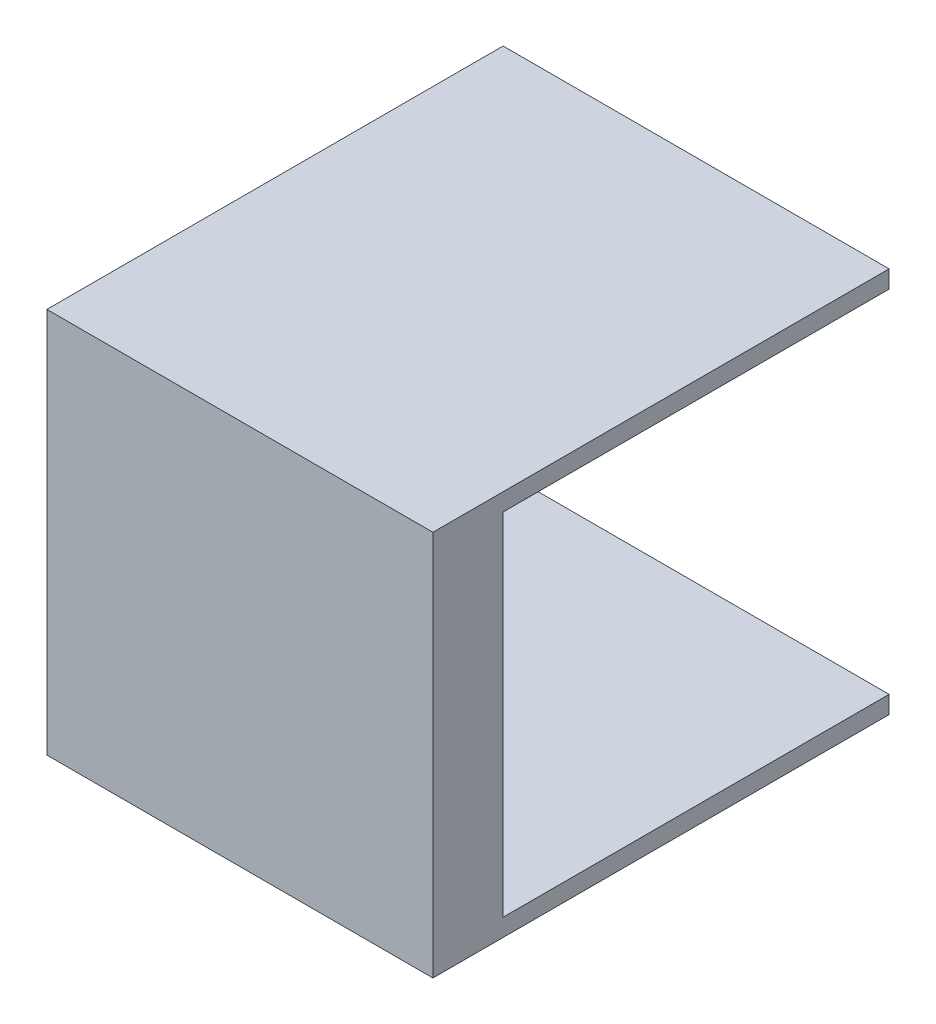
ISO-10303-21;
HEADER;
FILE_DESCRIPTION(('STEP AP214'),'2;1');
FILE_NAME('part.step','',(''),(''),'','','');
FILE_SCHEMA(('AUTOMOTIVE_DESIGN { 1 0 10303 214 1 1 1 1 }'));
ENDSEC;
DATA;
#1=APPLICATION_CONTEXT('core data for automotive mechanical design processes');
#2=APPLICATION_PROTOCOL_DEFINITION('international standard','automotive_design',2000,#1);
#3=PRODUCT_CONTEXT('',#1,'mechanical');
#4=PRODUCT('Part','Part','',(#3));
#5=PRODUCT_RELATED_PRODUCT_CATEGORY('part','',(#4));
#6=PRODUCT_DEFINITION_FORMATION('','',#4);
#7=PRODUCT_DEFINITION_CONTEXT('part definition',#1,'design');
#8=PRODUCT_DEFINITION('design','',#6,#7);
#9=PRODUCT_DEFINITION_SHAPE('','',#8);
#10=(LENGTH_UNIT() NAMED_UNIT(*) SI_UNIT(.MILLI.,.METRE.));
#11=(NAMED_UNIT(*) PLANE_ANGLE_UNIT() SI_UNIT($,.RADIAN.));
#12=(NAMED_UNIT(*) SI_UNIT($,.STERADIAN.) SOLID_ANGLE_UNIT());
#13=UNCERTAINTY_MEASURE_WITH_UNIT(LENGTH_MEASURE(1.E-05),#10,'distance_accuracy_value','');
#14=(GEOMETRIC_REPRESENTATION_CONTEXT(3) GLOBAL_UNCERTAINTY_ASSIGNED_CONTEXT((#13)) GLOBAL_UNIT_ASSIGNED_CONTEXT((#10,
#11,#12)) REPRESENTATION_CONTEXT('',''));
#15=CARTESIAN_POINT('',(0.,0.,0.));
#16=DIRECTION('',(0.,0.,1.));
#17=DIRECTION('',(1.,0.,0.));
#18=AXIS2_PLACEMENT_3D('',#15,#16,#17);
#19=CARTESIAN_POINT('',(55.,55.,130.));
#20=DIRECTION('',(-1.,0.,0.));
#21=DIRECTION('',(0.,-1.,0.));
#22=AXIS2_PLACEMENT_3D('',#19,#20,#21);
#23=PLANE('',#22);
#24=DIRECTION('',(0.,0.,1.));
#25=VECTOR('',#24,1.);
#26=CARTESIAN_POINT('',(55.,-50.,110.));
#27=LINE('',#26,#25);
#28=CARTESIAN_POINT('',(55.,-50.,0.));
#29=VERTEX_POINT('',#28);
#30=CARTESIAN_POINT('',(55.,-50.,110.));
#31=VERTEX_POINT('',#30);
#32=EDGE_CURVE('E118',#29,#31,#27,.T.);
#33=ORIENTED_EDGE('',*,*,#32,.T.);
#34=DIRECTION('',(0.,1.,0.));
#35=VECTOR('',#34,1.);
#36=CARTESIAN_POINT('',(55.,50.,110.));
#37=LINE('',#36,#35);
#38=CARTESIAN_POINT('',(55.,50.,110.));
#39=VERTEX_POINT('',#38);
#40=EDGE_CURVE('E129',#31,#39,#37,.T.);
#41=ORIENTED_EDGE('',*,*,#40,.T.);
#42=DIRECTION('',(0.,0.,-1.));
#43=VECTOR('',#42,1.);
#44=CARTESIAN_POINT('',(55.,50.,0.));
#45=LINE('',#44,#43);
#46=CARTESIAN_POINT('',(55.,50.,0.));
#47=VERTEX_POINT('',#46);
#48=EDGE_CURVE('E136',#39,#47,#45,.T.);
#49=ORIENTED_EDGE('',*,*,#48,.T.);
#50=DIRECTION('',(0.,1.,0.));
#51=VECTOR('',#50,1.);
#52=CARTESIAN_POINT('',(55.,55.,0.));
#53=LINE('',#52,#51);
#54=CARTESIAN_POINT('',(55.,55.,0.));
#55=VERTEX_POINT('',#54);
#56=EDGE_CURVE('E160',#47,#55,#53,.T.);
#57=ORIENTED_EDGE('',*,*,#56,.T.);
#58=DIRECTION('',(0.,0.,-1.));
#59=VECTOR('',#58,1.);
#60=CARTESIAN_POINT('',(55.,55.,130.));
#61=LINE('',#60,#59);
#62=CARTESIAN_POINT('',(55.,55.,130.));
#63=VERTEX_POINT('',#62);
#64=EDGE_CURVE('E11',#63,#55,#61,.T.);
#65=ORIENTED_EDGE('',*,*,#64,.F.);
#66=DIRECTION('',(0.,1.,0.));
#67=VECTOR('',#66,1.);
#68=CARTESIAN_POINT('',(55.,55.,130.));
#69=LINE('',#68,#67);
#70=CARTESIAN_POINT('',(55.,-55.,130.));
#71=VERTEX_POINT('',#70);
#72=EDGE_CURVE('E163',#71,#63,#69,.T.);
#73=ORIENTED_EDGE('',*,*,#72,.F.);
#74=DIRECTION('',(0.,0.,-1.));
#75=VECTOR('',#74,1.);
#76=CARTESIAN_POINT('',(55.,-55.,130.));
#77=LINE('',#76,#75);
#78=CARTESIAN_POINT('',(55.,-55.,0.));
#79=VERTEX_POINT('',#78);
#80=EDGE_CURVE('E173',#71,#79,#77,.T.);
#81=ORIENTED_EDGE('',*,*,#80,.T.);
#82=EDGE_CURVE('E139',#79,#29,#53,.T.);
#83=ORIENTED_EDGE('',*,*,#82,.T.);
#84=EDGE_LOOP('',(#33,#41,#49,#57,#65,#73,#81,#83));
#85=FACE_BOUND('',#84,.T.);
#86=ADVANCED_FACE('F39',(#85),#23,.F.);
#87=CARTESIAN_POINT('',(0.,0.,0.));
#88=DIRECTION('',(0.,0.,1.));
#89=DIRECTION('',(1.,0.,0.));
#90=AXIS2_PLACEMENT_3D('',#87,#88,#89);
#91=PLANE('',#90);
#92=DIRECTION('',(-1.,0.,0.));
#93=VECTOR('',#92,1.);
#94=CARTESIAN_POINT('',(50.,-50.,0.));
#95=LINE('',#94,#93);
#96=CARTESIAN_POINT('',(-50.,-50.,0.));
#97=VERTEX_POINT('',#96);
#98=EDGE_CURVE('E148',#29,#97,#95,.T.);
#99=ORIENTED_EDGE('',*,*,#98,.F.);
#100=ORIENTED_EDGE('',*,*,#82,.F.);
#101=DIRECTION('',(1.,0.,0.));
#102=VECTOR('',#101,1.);
#103=CARTESIAN_POINT('',(-55.,-55.,0.));
#104=LINE('',#103,#102);
#105=CARTESIAN_POINT('',(-55.,-55.,0.));
#106=VERTEX_POINT('',#105);
#107=EDGE_CURVE('E84',#106,#79,#104,.T.);
#108=ORIENTED_EDGE('',*,*,#107,.F.);
#109=DIRECTION('',(0.,-1.,0.));
#110=VECTOR('',#109,1.);
#111=CARTESIAN_POINT('',(-55.,55.,0.));
#112=LINE('',#111,#110);
#113=CARTESIAN_POINT('',(-55.,55.,0.));
#114=VERTEX_POINT('',#113);
#115=EDGE_CURVE('E179',#114,#106,#112,.T.);
#116=ORIENTED_EDGE('',*,*,#115,.F.);
#117=DIRECTION('',(-1.,0.,0.));
#118=VECTOR('',#117,1.);
#119=CARTESIAN_POINT('',(-55.,55.,0.));
#120=LINE('',#119,#118);
#121=EDGE_CURVE('E176',#55,#114,#120,.T.);
#122=ORIENTED_EDGE('',*,*,#121,.F.);
#123=ORIENTED_EDGE('',*,*,#56,.F.);
#124=DIRECTION('',(1.,0.,0.));
#125=VECTOR('',#124,1.);
#126=CARTESIAN_POINT('',(50.,50.,0.));
#127=LINE('',#126,#125);
#128=CARTESIAN_POINT('',(-50.,50.,0.));
#129=VERTEX_POINT('',#128);
#130=EDGE_CURVE('E153',#129,#47,#127,.T.);
#131=ORIENTED_EDGE('',*,*,#130,.F.);
#132=DIRECTION('',(0.,1.,0.));
#133=VECTOR('',#132,1.);
#134=CARTESIAN_POINT('',(-50.,50.,0.));
#135=LINE('',#134,#133);
#136=EDGE_CURVE('E54',#97,#129,#135,.T.);
#137=ORIENTED_EDGE('',*,*,#136,.F.);
#138=EDGE_LOOP('',(#99,#100,#108,#116,#122,#123,#131,#137));
#139=FACE_BOUND('',#138,.T.);
#140=ADVANCED_FACE('F197',(#139),#91,.F.);
#141=CARTESIAN_POINT('',(-55.,55.,130.));
#142=DIRECTION('',(0.,-1.,0.));
#143=DIRECTION('',(0.,0.,-1.));
#144=AXIS2_PLACEMENT_3D('',#141,#142,#143);
#145=PLANE('',#144);
#146=ORIENTED_EDGE('',*,*,#121,.T.);
#147=DIRECTION('',(0.,0.,-1.));
#148=VECTOR('',#147,1.);
#149=CARTESIAN_POINT('',(-55.,55.,130.));
#150=LINE('',#149,#148);
#151=CARTESIAN_POINT('',(-55.,55.,130.));
#152=VERTEX_POINT('',#151);
#153=EDGE_CURVE('E47',#152,#114,#150,.T.);
#154=ORIENTED_EDGE('',*,*,#153,.F.);
#155=DIRECTION('',(-1.,0.,0.));
#156=VECTOR('',#155,1.);
#157=CARTESIAN_POINT('',(-55.,55.,130.));
#158=LINE('',#157,#156);
#159=EDGE_CURVE('E91',#63,#152,#158,.T.);
#160=ORIENTED_EDGE('',*,*,#159,.F.);
#161=ORIENTED_EDGE('',*,*,#64,.T.);
#162=EDGE_LOOP('',(#146,#154,#160,#161));
#163=FACE_BOUND('',#162,.T.);
#164=ADVANCED_FACE('F206',(#163),#145,.F.);
#165=CARTESIAN_POINT('',(-55.,55.,130.));
#166=DIRECTION('',(1.,0.,0.));
#167=DIRECTION('',(0.,1.,0.));
#168=AXIS2_PLACEMENT_3D('',#165,#166,#167);
#169=PLANE('',#168);
#170=ORIENTED_EDGE('',*,*,#115,.T.);
#171=DIRECTION('',(0.,0.,-1.));
#172=VECTOR('',#171,1.);
#173=CARTESIAN_POINT('',(-55.,-55.,130.));
#174=LINE('',#173,#172);
#175=CARTESIAN_POINT('',(-55.,-55.,130.));
#176=VERTEX_POINT('',#175);
#177=EDGE_CURVE('E186',#176,#106,#174,.T.);
#178=ORIENTED_EDGE('',*,*,#177,.F.);
#179=DIRECTION('',(0.,-1.,0.));
#180=VECTOR('',#179,1.);
#181=CARTESIAN_POINT('',(-55.,55.,130.));
#182=LINE('',#181,#180);
#183=EDGE_CURVE('E168',#152,#176,#182,.T.);
#184=ORIENTED_EDGE('',*,*,#183,.F.);
#185=ORIENTED_EDGE('',*,*,#153,.T.);
#186=EDGE_LOOP('',(#170,#178,#184,#185));
#187=FACE_BOUND('',#186,.T.);
#188=ADVANCED_FACE('F193',(#187),#169,.F.);
#189=CARTESIAN_POINT('',(-55.,-55.,130.));
#190=DIRECTION('',(0.,1.,0.));
#191=DIRECTION('',(0.,0.,1.));
#192=AXIS2_PLACEMENT_3D('',#189,#190,#191);
#193=PLANE('',#192);
#194=ORIENTED_EDGE('',*,*,#107,.T.);
#195=ORIENTED_EDGE('',*,*,#80,.F.);
#196=DIRECTION('',(1.,0.,0.));
#197=VECTOR('',#196,1.);
#198=CARTESIAN_POINT('',(-55.,-55.,130.));
#199=LINE('',#198,#197);
#200=EDGE_CURVE('E63',#176,#71,#199,.T.);
#201=ORIENTED_EDGE('',*,*,#200,.F.);
#202=ORIENTED_EDGE('',*,*,#177,.T.);
#203=EDGE_LOOP('',(#194,#195,#201,#202));
#204=FACE_BOUND('',#203,.T.);
#205=ADVANCED_FACE('F212',(#204),#193,.F.);
#206=CARTESIAN_POINT('',(0.,0.,130.));
#207=DIRECTION('',(0.,0.,1.));
#208=DIRECTION('',(1.,0.,0.));
#209=AXIS2_PLACEMENT_3D('',#206,#207,#208);
#210=PLANE('',#209);
#211=ORIENTED_EDGE('',*,*,#72,.T.);
#212=ORIENTED_EDGE('',*,*,#159,.T.);
#213=ORIENTED_EDGE('',*,*,#183,.T.);
#214=ORIENTED_EDGE('',*,*,#200,.T.);
#215=EDGE_LOOP('',(#211,#212,#213,#214));
#216=FACE_BOUND('',#215,.T.);
#217=ADVANCED_FACE('F265',(#216),#210,.T.);
#218=CARTESIAN_POINT('',(-50.,50.,110.));
#219=DIRECTION('',(-1.,0.,0.));
#220=DIRECTION('',(0.,-1.,0.));
#221=AXIS2_PLACEMENT_3D('',#218,#219,#220);
#222=PLANE('',#221);
#223=ORIENTED_EDGE('',*,*,#136,.T.);
#224=DIRECTION('',(0.,0.,-1.));
#225=VECTOR('',#224,1.);
#226=CARTESIAN_POINT('',(-50.,50.,110.));
#227=LINE('',#226,#225);
#228=CARTESIAN_POINT('',(-50.,50.,110.));
#229=VERTEX_POINT('',#228);
#230=EDGE_CURVE('E125',#229,#129,#227,.T.);
#231=ORIENTED_EDGE('',*,*,#230,.F.);
#232=DIRECTION('',(0.,1.,0.));
#233=VECTOR('',#232,1.);
#234=CARTESIAN_POINT('',(-50.,50.,110.));
#235=LINE('',#234,#233);
#236=CARTESIAN_POINT('',(-50.,-50.,110.));
#237=VERTEX_POINT('',#236);
#238=EDGE_CURVE('E145',#237,#229,#235,.T.);
#239=ORIENTED_EDGE('',*,*,#238,.F.);
#240=DIRECTION('',(0.,0.,-1.));
#241=VECTOR('',#240,1.);
#242=CARTESIAN_POINT('',(-50.,-50.,110.));
#243=LINE('',#242,#241);
#244=EDGE_CURVE('E120',#237,#97,#243,.T.);
#245=ORIENTED_EDGE('',*,*,#244,.T.);
#246=EDGE_LOOP('',(#223,#231,#239,#245));
#247=FACE_BOUND('',#246,.T.);
#248=ADVANCED_FACE('F200',(#247),#222,.F.);
#249=CARTESIAN_POINT('',(50.,-50.,110.));
#250=DIRECTION('',(0.,-1.,0.));
#251=DIRECTION('',(0.,0.,-1.));
#252=AXIS2_PLACEMENT_3D('',#249,#250,#251);
#253=PLANE('',#252);
#254=ORIENTED_EDGE('',*,*,#244,.F.);
#255=DIRECTION('',(-1.,0.,0.));
#256=VECTOR('',#255,1.);
#257=CARTESIAN_POINT('',(50.,-50.,110.));
#258=LINE('',#257,#256);
#259=EDGE_CURVE('E114',#31,#237,#258,.T.);
#260=ORIENTED_EDGE('',*,*,#259,.F.);
#261=ORIENTED_EDGE('',*,*,#32,.F.);
#262=ORIENTED_EDGE('',*,*,#98,.T.);
#263=EDGE_LOOP('',(#254,#260,#261,#262));
#264=FACE_BOUND('',#263,.T.);
#265=ADVANCED_FACE('F116',(#264),#253,.F.);
#266=CARTESIAN_POINT('',(50.,50.,110.));
#267=DIRECTION('',(0.,1.,0.));
#268=DIRECTION('',(0.,0.,1.));
#269=AXIS2_PLACEMENT_3D('',#266,#267,#268);
#270=PLANE('',#269);
#271=ORIENTED_EDGE('',*,*,#130,.T.);
#272=ORIENTED_EDGE('',*,*,#48,.F.);
#273=DIRECTION('',(1.,0.,0.));
#274=VECTOR('',#273,1.);
#275=CARTESIAN_POINT('',(50.,50.,110.));
#276=LINE('',#275,#274);
#277=EDGE_CURVE('E126',#229,#39,#276,.T.);
#278=ORIENTED_EDGE('',*,*,#277,.F.);
#279=ORIENTED_EDGE('',*,*,#230,.T.);
#280=EDGE_LOOP('',(#271,#272,#278,#279));
#281=FACE_BOUND('',#280,.T.);
#282=ADVANCED_FACE('F202',(#281),#270,.F.);
#283=CARTESIAN_POINT('',(0.,0.,110.));
#284=DIRECTION('',(0.,0.,-1.));
#285=DIRECTION('',(-1.,0.,0.));
#286=AXIS2_PLACEMENT_3D('',#283,#284,#285);
#287=PLANE('',#286);
#288=ORIENTED_EDGE('',*,*,#277,.T.);
#289=ORIENTED_EDGE('',*,*,#40,.F.);
#290=ORIENTED_EDGE('',*,*,#259,.T.);
#291=ORIENTED_EDGE('',*,*,#238,.T.);
#292=EDGE_LOOP('',(#288,#289,#290,#291));
#293=FACE_BOUND('',#292,.T.);
#294=ADVANCED_FACE('F130',(#293),#287,.T.);
#295=CLOSED_SHELL('',(#86,#140,#164,#188,#205,#217,#248,#265,#282,#294));
#296=MANIFOLD_SOLID_BREP('B2',#295);
#297=ADVANCED_BREP_SHAPE_REPRESENTATION('',(#18,#296),#14);
#298=SHAPE_DEFINITION_REPRESENTATION(#9,#297);
ENDSEC;
END-ISO-10303-21;
